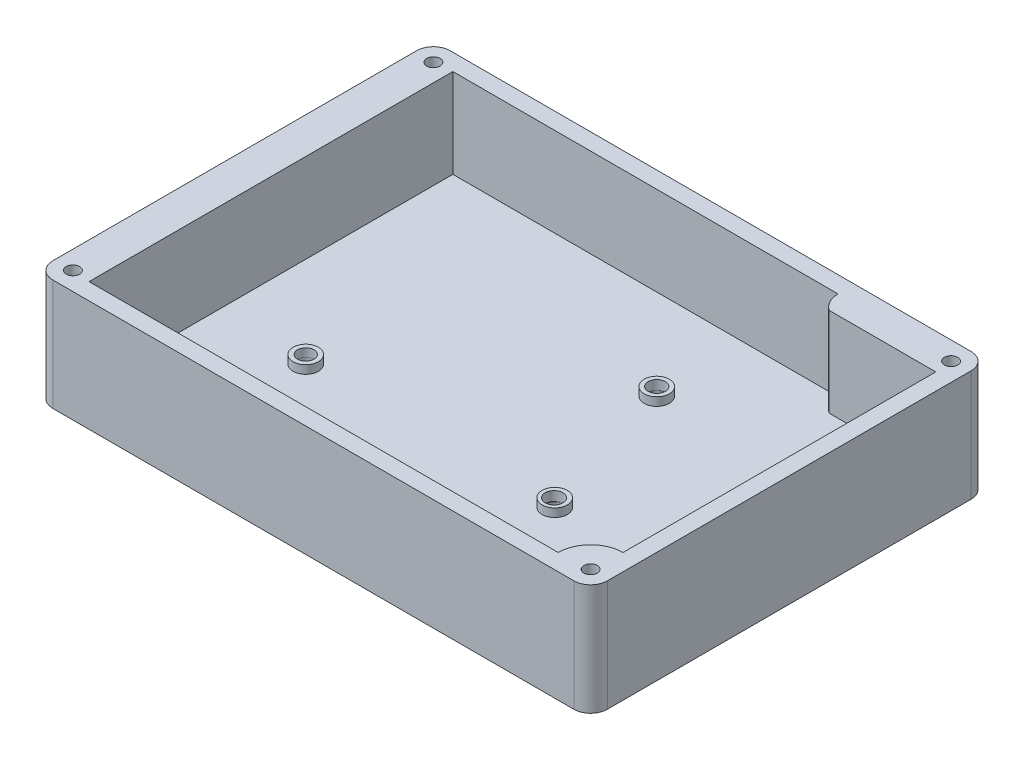
ISO-10303-21;
HEADER;
FILE_DESCRIPTION(('STEP AP214'),'2;1');
FILE_NAME('part.step','',(''),(''),'','','');
FILE_SCHEMA(('AUTOMOTIVE_DESIGN { 1 0 10303 214 1 1 1 1 }'));
ENDSEC;
DATA;
#1=APPLICATION_CONTEXT('core data for automotive mechanical design processes');
#2=APPLICATION_PROTOCOL_DEFINITION('international standard','automotive_design',2000,#1);
#3=PRODUCT_CONTEXT('',#1,'mechanical');
#4=PRODUCT('Part','Part','',(#3));
#5=PRODUCT_RELATED_PRODUCT_CATEGORY('part','',(#4));
#6=PRODUCT_DEFINITION_FORMATION('','',#4);
#7=PRODUCT_DEFINITION_CONTEXT('part definition',#1,'design');
#8=PRODUCT_DEFINITION('design','',#6,#7);
#9=PRODUCT_DEFINITION_SHAPE('','',#8);
#10=(LENGTH_UNIT() NAMED_UNIT(*) SI_UNIT(.MILLI.,.METRE.));
#11=(NAMED_UNIT(*) PLANE_ANGLE_UNIT() SI_UNIT($,.RADIAN.));
#12=(NAMED_UNIT(*) SI_UNIT($,.STERADIAN.) SOLID_ANGLE_UNIT());
#13=UNCERTAINTY_MEASURE_WITH_UNIT(LENGTH_MEASURE(1.E-05),#10,'distance_accuracy_value','');
#14=(GEOMETRIC_REPRESENTATION_CONTEXT(3) GLOBAL_UNCERTAINTY_ASSIGNED_CONTEXT((#13)) GLOBAL_UNIT_ASSIGNED_CONTEXT((#10,
#11,#12)) REPRESENTATION_CONTEXT('',''));
#15=CARTESIAN_POINT('',(0.,0.,0.));
#16=DIRECTION('',(0.,0.,1.));
#17=DIRECTION('',(1.,0.,0.));
#18=AXIS2_PLACEMENT_3D('',#15,#16,#17);
#19=CARTESIAN_POINT('',(48.075,20.,-35.695));
#20=DIRECTION('',(-1.,0.,0.));
#21=DIRECTION('',(0.,0.,1.));
#22=AXIS2_PLACEMENT_3D('',#19,#20,#21);
#23=PLANE('',#22);
#24=DIRECTION('',(0.,0.,-1.));
#25=VECTOR('',#24,1.);
#26=CARTESIAN_POINT('',(48.075,20.,-35.695));
#27=LINE('',#26,#25);
#28=CARTESIAN_POINT('',(48.075,20.,32.695));
#29=VERTEX_POINT('',#28);
#30=CARTESIAN_POINT('',(48.075,20.,-32.695));
#31=VERTEX_POINT('',#30);
#32=EDGE_CURVE('E520',#29,#31,#27,.T.);
#33=ORIENTED_EDGE('',*,*,#32,.F.);
#34=DIRECTION('',(0.,-1.,0.));
#35=VECTOR('',#34,1.);
#36=CARTESIAN_POINT('',(48.075,20.,32.695));
#37=LINE('',#36,#35);
#38=CARTESIAN_POINT('',(48.075,0.,32.695));
#39=VERTEX_POINT('',#38);
#40=EDGE_CURVE('E385',#29,#39,#37,.T.);
#41=ORIENTED_EDGE('',*,*,#40,.T.);
#42=DIRECTION('',(0.,0.,-1.));
#43=VECTOR('',#42,1.);
#44=CARTESIAN_POINT('',(48.075,0.,-35.695));
#45=LINE('',#44,#43);
#46=CARTESIAN_POINT('',(48.075,0.,-32.695));
#47=VERTEX_POINT('',#46);
#48=EDGE_CURVE('E507',#39,#47,#45,.T.);
#49=ORIENTED_EDGE('',*,*,#48,.T.);
#50=DIRECTION('',(0.,-1.,0.));
#51=VECTOR('',#50,1.);
#52=CARTESIAN_POINT('',(48.075,20.,-32.695));
#53=LINE('',#52,#51);
#54=EDGE_CURVE('E403',#47,#31,#53,.F.);
#55=ORIENTED_EDGE('',*,*,#54,.T.);
#56=EDGE_LOOP('',(#33,#41,#49,#55));
#57=FACE_BOUND('',#56,.T.);
#58=ADVANCED_FACE('F43',(#57),#23,.F.);
#59=CARTESIAN_POINT('',(-48.075,20.,-35.695));
#60=DIRECTION('',(0.,0.,1.));
#61=DIRECTION('',(1.,0.,0.));
#62=AXIS2_PLACEMENT_3D('',#59,#60,#61);
#63=PLANE('',#62);
#64=DIRECTION('',(-1.,0.,0.));
#65=VECTOR('',#64,1.);
#66=CARTESIAN_POINT('',(-48.075,0.,-35.695));
#67=LINE('',#66,#65);
#68=CARTESIAN_POINT('',(45.075,0.,-35.695));
#69=VERTEX_POINT('',#68);
#70=CARTESIAN_POINT('',(-48.575,0.,-35.695));
#71=VERTEX_POINT('',#70);
#72=EDGE_CURVE('E534',#69,#71,#67,.T.);
#73=ORIENTED_EDGE('',*,*,#72,.T.);
#74=DIRECTION('',(0.,-1.,0.));
#75=VECTOR('',#74,1.);
#76=CARTESIAN_POINT('',(-48.575,20.,-35.695));
#77=LINE('',#76,#75);
#78=CARTESIAN_POINT('',(-48.575,20.,-35.695));
#79=VERTEX_POINT('',#78);
#80=EDGE_CURVE('E394',#71,#79,#77,.F.);
#81=ORIENTED_EDGE('',*,*,#80,.T.);
#82=DIRECTION('',(-1.,0.,0.));
#83=VECTOR('',#82,1.);
#84=CARTESIAN_POINT('',(-48.075,20.,-35.695));
#85=LINE('',#84,#83);
#86=CARTESIAN_POINT('',(45.075,20.,-35.695));
#87=VERTEX_POINT('',#86);
#88=EDGE_CURVE('E522',#87,#79,#85,.T.);
#89=ORIENTED_EDGE('',*,*,#88,.F.);
#90=DIRECTION('',(0.,-1.,0.));
#91=VECTOR('',#90,1.);
#92=CARTESIAN_POINT('',(45.075,20.,-35.695));
#93=LINE('',#92,#91);
#94=EDGE_CURVE('E553',#87,#69,#93,.T.);
#95=ORIENTED_EDGE('',*,*,#94,.T.);
#96=EDGE_LOOP('',(#73,#81,#89,#95));
#97=FACE_BOUND('',#96,.T.);
#98=ADVANCED_FACE('F360',(#97),#63,.F.);
#99=CARTESIAN_POINT('',(-51.575,20.,-35.695));
#100=DIRECTION('',(1.,0.,0.));
#101=DIRECTION('',(0.,0.,-1.));
#102=AXIS2_PLACEMENT_3D('',#99,#100,#101);
#103=PLANE('',#102);
#104=DIRECTION('',(0.,0.,1.));
#105=VECTOR('',#104,1.);
#106=CARTESIAN_POINT('',(-51.575,20.,-35.695));
#107=LINE('',#106,#105);
#108=CARTESIAN_POINT('',(-51.575,20.,-32.695));
#109=VERTEX_POINT('',#108);
#110=CARTESIAN_POINT('',(-51.575,20.,32.695));
#111=VERTEX_POINT('',#110);
#112=EDGE_CURVE('E526',#109,#111,#107,.T.);
#113=ORIENTED_EDGE('',*,*,#112,.F.);
#114=DIRECTION('',(0.,-1.,0.));
#115=VECTOR('',#114,1.);
#116=CARTESIAN_POINT('',(-51.575,20.,-32.695));
#117=LINE('',#116,#115);
#118=CARTESIAN_POINT('',(-51.575,0.,-32.695));
#119=VERTEX_POINT('',#118);
#120=EDGE_CURVE('E542',#109,#119,#117,.T.);
#121=ORIENTED_EDGE('',*,*,#120,.T.);
#122=DIRECTION('',(0.,0.,1.));
#123=VECTOR('',#122,1.);
#124=CARTESIAN_POINT('',(-51.575,0.,-35.695));
#125=LINE('',#124,#123);
#126=CARTESIAN_POINT('',(-51.575,0.,32.695));
#127=VERTEX_POINT('',#126);
#128=EDGE_CURVE('E537',#119,#127,#125,.T.);
#129=ORIENTED_EDGE('',*,*,#128,.T.);
#130=DIRECTION('',(0.,-1.,0.));
#131=VECTOR('',#130,1.);
#132=CARTESIAN_POINT('',(-51.575,20.,32.695));
#133=LINE('',#132,#131);
#134=EDGE_CURVE('E531',#127,#111,#133,.F.);
#135=ORIENTED_EDGE('',*,*,#134,.T.);
#136=EDGE_LOOP('',(#113,#121,#129,#135));
#137=FACE_BOUND('',#136,.T.);
#138=ADVANCED_FACE('F357',(#137),#103,.F.);
#139=CARTESIAN_POINT('',(-48.075,20.,35.695));
#140=DIRECTION('',(0.,0.,-1.));
#141=DIRECTION('',(-1.,0.,0.));
#142=AXIS2_PLACEMENT_3D('',#139,#140,#141);
#143=PLANE('',#142);
#144=DIRECTION('',(1.,0.,0.));
#145=VECTOR('',#144,1.);
#146=CARTESIAN_POINT('',(-51.575,20.,35.695));
#147=LINE('',#146,#145);
#148=CARTESIAN_POINT('',(-48.575,20.,35.695));
#149=VERTEX_POINT('',#148);
#150=CARTESIAN_POINT('',(45.075,20.,35.695));
#151=VERTEX_POINT('',#150);
#152=EDGE_CURVE('E529',#149,#151,#147,.T.);
#153=ORIENTED_EDGE('',*,*,#152,.F.);
#154=DIRECTION('',(0.,-1.,0.));
#155=VECTOR('',#154,1.);
#156=CARTESIAN_POINT('',(-48.575,20.,35.695));
#157=LINE('',#156,#155);
#158=CARTESIAN_POINT('',(-48.575,0.,35.695));
#159=VERTEX_POINT('',#158);
#160=EDGE_CURVE('E400',#149,#159,#157,.T.);
#161=ORIENTED_EDGE('',*,*,#160,.T.);
#162=DIRECTION('',(1.,0.,0.));
#163=VECTOR('',#162,1.);
#164=CARTESIAN_POINT('',(-48.075,0.,35.695));
#165=LINE('',#164,#163);
#166=CARTESIAN_POINT('',(45.075,0.,35.695));
#167=VERTEX_POINT('',#166);
#168=EDGE_CURVE('E523',#159,#167,#165,.T.);
#169=ORIENTED_EDGE('',*,*,#168,.T.);
#170=DIRECTION('',(0.,-1.,0.));
#171=VECTOR('',#170,1.);
#172=CARTESIAN_POINT('',(45.075,20.,35.695));
#173=LINE('',#172,#171);
#174=EDGE_CURVE('E70',#167,#151,#173,.F.);
#175=ORIENTED_EDGE('',*,*,#174,.T.);
#176=EDGE_LOOP('',(#153,#161,#169,#175));
#177=FACE_BOUND('',#176,.T.);
#178=ADVANCED_FACE('F350',(#177),#143,.F.);
#179=CARTESIAN_POINT('',(0.,20.,0.));
#180=DIRECTION('',(0.,1.,0.));
#181=DIRECTION('',(0.,0.,1.));
#182=AXIS2_PLACEMENT_3D('',#179,#180,#181);
#183=PLANE('',#182);
#184=CARTESIAN_POINT('',(44.775,20.,32.395));
#185=DIRECTION('',(0.,1.,0.));
#186=DIRECTION('',(0.,0.,-1.));
#187=AXIS2_PLACEMENT_3D('',#184,#185,#186);
#188=CIRCLE('',#187,1.2);
#189=CARTESIAN_POINT('',(44.775,20.,31.195));
#190=VERTEX_POINT('',#189);
#191=EDGE_CURVE('E450',#190,#190,#188,.T.);
#192=ORIENTED_EDGE('',*,*,#191,.F.);
#193=EDGE_LOOP('',(#192));
#194=FACE_BOUND('',#193,.T.);
#195=CARTESIAN_POINT('',(-48.275,20.,-32.395));
#196=DIRECTION('',(0.,1.,0.));
#197=DIRECTION('',(0.,0.,-1.));
#198=AXIS2_PLACEMENT_3D('',#195,#196,#197);
#199=CIRCLE('',#198,1.2);
#200=CARTESIAN_POINT('',(-48.275,20.,-33.595));
#201=VERTEX_POINT('',#200);
#202=EDGE_CURVE('E443',#201,#201,#199,.T.);
#203=ORIENTED_EDGE('',*,*,#202,.F.);
#204=EDGE_LOOP('',(#203));
#205=FACE_BOUND('',#204,.T.);
#206=CARTESIAN_POINT('',(44.775,20.,-32.395));
#207=DIRECTION('',(0.,1.,0.));
#208=DIRECTION('',(0.,0.,1.));
#209=AXIS2_PLACEMENT_3D('',#206,#207,#208);
#210=CIRCLE('',#209,1.2);
#211=CARTESIAN_POINT('',(44.775,20.,-31.195));
#212=VERTEX_POINT('',#211);
#213=EDGE_CURVE('E439',#212,#212,#210,.T.);
#214=ORIENTED_EDGE('',*,*,#213,.F.);
#215=EDGE_LOOP('',(#214));
#216=FACE_BOUND('',#215,.T.);
#217=CARTESIAN_POINT('',(-48.275,20.,32.395));
#218=DIRECTION('',(0.,1.,0.));
#219=DIRECTION('',(0.,0.,1.));
#220=AXIS2_PLACEMENT_3D('',#217,#218,#219);
#221=CIRCLE('',#220,1.2);
#222=CARTESIAN_POINT('',(-48.275,20.,33.595));
#223=VERTEX_POINT('',#222);
#224=EDGE_CURVE('E449',#223,#223,#221,.T.);
#225=ORIENTED_EDGE('',*,*,#224,.F.);
#226=EDGE_LOOP('',(#225));
#227=FACE_BOUND('',#226,.T.);
#228=DIRECTION('',(0.,0.,1.));
#229=VECTOR('',#228,1.);
#230=CARTESIAN_POINT('',(-45.075,20.,-32.695));
#231=LINE('',#230,#229);
#232=CARTESIAN_POINT('',(-45.075,20.,-32.695));
#233=VERTEX_POINT('',#232);
#234=CARTESIAN_POINT('',(-45.075,20.,32.695));
#235=VERTEX_POINT('',#234);
#236=EDGE_CURVE('E461',#233,#235,#231,.T.);
#237=ORIENTED_EDGE('',*,*,#236,.F.);
#238=DIRECTION('',(-1.,0.,0.));
#239=VECTOR('',#238,1.);
#240=CARTESIAN_POINT('',(-45.075,20.,-32.695));
#241=LINE('',#240,#239);
#242=CARTESIAN_POINT('',(24.1500945233502,20.,-32.695));
#243=VERTEX_POINT('',#242);
#244=EDGE_CURVE('E468',#243,#233,#241,.T.);
#245=ORIENTED_EDGE('',*,*,#244,.F.);
#246=CARTESIAN_POINT('',(28.2278468412559,20.,-32.695));
#247=DIRECTION('',(0.,-1.,0.));
#248=DIRECTION('',(0.,0.,-1.));
#249=AXIS2_PLACEMENT_3D('',#246,#247,#248);
#250=CIRCLE('',#249,4.07775231790571);
#251=CARTESIAN_POINT('',(25.9073219472979,20.,-29.3419076686279));
#252=VERTEX_POINT('',#251);
#253=EDGE_CURVE('E500',#252,#243,#250,.T.);
#254=ORIENTED_EDGE('',*,*,#253,.F.);
#255=DIRECTION('',(-1.,0.,0.));
#256=VECTOR('',#255,1.);
#257=CARTESIAN_POINT('',(45.075,20.,-29.3419076686279));
#258=LINE('',#257,#256);
#259=CARTESIAN_POINT('',(45.075,20.,-29.3419076686279));
#260=VERTEX_POINT('',#259);
#261=EDGE_CURVE('E497',#260,#252,#258,.T.);
#262=ORIENTED_EDGE('',*,*,#261,.F.);
#263=DIRECTION('',(0.,0.,-1.));
#264=VECTOR('',#263,1.);
#265=CARTESIAN_POINT('',(45.075,20.,-29.3419076686279));
#266=LINE('',#265,#264);
#267=CARTESIAN_POINT('',(45.075,20.,26.8743007012948));
#268=VERTEX_POINT('',#267);
#269=EDGE_CURVE('E494',#268,#260,#266,.T.);
#270=ORIENTED_EDGE('',*,*,#269,.F.);
#271=CARTESIAN_POINT('',(45.075,20.,32.695));
#272=DIRECTION('',(0.,-1.,0.));
#273=DIRECTION('',(0.,0.,1.));
#274=AXIS2_PLACEMENT_3D('',#271,#272,#273);
#275=CIRCLE('',#274,5.8206992987052);
#276=CARTESIAN_POINT('',(39.2543007012948,20.,32.695));
#277=VERTEX_POINT('',#276);
#278=EDGE_CURVE('E491',#277,#268,#275,.T.);
#279=ORIENTED_EDGE('',*,*,#278,.F.);
#280=DIRECTION('',(1.,0.,0.));
#281=VECTOR('',#280,1.);
#282=CARTESIAN_POINT('',(-45.075,20.,32.695));
#283=LINE('',#282,#281);
#284=EDGE_CURVE('E488',#235,#277,#283,.T.);
#285=ORIENTED_EDGE('',*,*,#284,.F.);
#286=EDGE_LOOP('',(#237,#245,#254,#262,#270,#279,#285));
#287=FACE_BOUND('',#286,.T.);
#288=ORIENTED_EDGE('',*,*,#88,.T.);
#289=CARTESIAN_POINT('',(-48.575,20.,-32.695));
#290=DIRECTION('',(0.,1.,0.));
#291=DIRECTION('',(0.,0.,1.));
#292=AXIS2_PLACEMENT_3D('',#289,#290,#291);
#293=CIRCLE('',#292,3.);
#294=EDGE_CURVE('E392',#79,#109,#293,.T.);
#295=ORIENTED_EDGE('',*,*,#294,.T.);
#296=ORIENTED_EDGE('',*,*,#112,.T.);
#297=CARTESIAN_POINT('',(-48.575,20.,32.695));
#298=DIRECTION('',(0.,1.,0.));
#299=DIRECTION('',(0.,0.,1.));
#300=AXIS2_PLACEMENT_3D('',#297,#298,#299);
#301=CIRCLE('',#300,3.);
#302=EDGE_CURVE('E389',#111,#149,#301,.T.);
#303=ORIENTED_EDGE('',*,*,#302,.T.);
#304=ORIENTED_EDGE('',*,*,#152,.T.);
#305=CARTESIAN_POINT('',(45.075,20.,32.695));
#306=DIRECTION('',(0.,1.,0.));
#307=DIRECTION('',(0.,0.,1.));
#308=AXIS2_PLACEMENT_3D('',#305,#306,#307);
#309=CIRCLE('',#308,3.);
#310=EDGE_CURVE('E383',#151,#29,#309,.T.);
#311=ORIENTED_EDGE('',*,*,#310,.T.);
#312=ORIENTED_EDGE('',*,*,#32,.T.);
#313=CARTESIAN_POINT('',(45.075,20.,-32.695));
#314=DIRECTION('',(0.,1.,0.));
#315=DIRECTION('',(0.,0.,1.));
#316=AXIS2_PLACEMENT_3D('',#313,#314,#315);
#317=CIRCLE('',#316,3.);
#318=EDGE_CURVE('E390',#31,#87,#317,.T.);
#319=ORIENTED_EDGE('',*,*,#318,.T.);
#320=EDGE_LOOP('',(#288,#295,#296,#303,#304,#311,#312,#319));
#321=FACE_BOUND('',#320,.T.);
#322=ADVANCED_FACE('F347',(#194,#205,#216,#227,#287,#321),#183,.T.);
#323=CARTESIAN_POINT('',(0.,0.,0.));
#324=DIRECTION('',(0.,1.,0.));
#325=DIRECTION('',(0.,0.,1.));
#326=AXIS2_PLACEMENT_3D('',#323,#324,#325);
#327=PLANE('',#326);
#328=ORIENTED_EDGE('',*,*,#128,.F.);
#329=CARTESIAN_POINT('',(-48.575,0.,-32.695));
#330=DIRECTION('',(0.,1.,0.));
#331=DIRECTION('',(0.,0.,1.));
#332=AXIS2_PLACEMENT_3D('',#329,#330,#331);
#333=CIRCLE('',#332,3.);
#334=EDGE_CURVE('E551',#119,#71,#333,.F.);
#335=ORIENTED_EDGE('',*,*,#334,.T.);
#336=ORIENTED_EDGE('',*,*,#72,.F.);
#337=CARTESIAN_POINT('',(45.075,0.,-32.695));
#338=DIRECTION('',(0.,1.,0.));
#339=DIRECTION('',(0.,0.,1.));
#340=AXIS2_PLACEMENT_3D('',#337,#338,#339);
#341=CIRCLE('',#340,3.);
#342=EDGE_CURVE('E545',#69,#47,#341,.F.);
#343=ORIENTED_EDGE('',*,*,#342,.T.);
#344=ORIENTED_EDGE('',*,*,#48,.F.);
#345=CARTESIAN_POINT('',(45.075,0.,32.695));
#346=DIRECTION('',(0.,1.,0.));
#347=DIRECTION('',(0.,0.,1.));
#348=AXIS2_PLACEMENT_3D('',#345,#346,#347);
#349=CIRCLE('',#348,3.);
#350=EDGE_CURVE('E547',#39,#167,#349,.F.);
#351=ORIENTED_EDGE('',*,*,#350,.T.);
#352=ORIENTED_EDGE('',*,*,#168,.F.);
#353=CARTESIAN_POINT('',(-48.575,0.,32.695));
#354=DIRECTION('',(0.,1.,0.));
#355=DIRECTION('',(0.,0.,1.));
#356=AXIS2_PLACEMENT_3D('',#353,#354,#355);
#357=CIRCLE('',#356,3.);
#358=EDGE_CURVE('E549',#159,#127,#357,.F.);
#359=ORIENTED_EDGE('',*,*,#358,.T.);
#360=EDGE_LOOP('',(#328,#335,#336,#343,#344,#351,#352,#359));
#361=FACE_BOUND('',#360,.T.);
#362=ADVANCED_FACE('F345',(#361),#327,.F.);
#363=CARTESIAN_POINT('',(-45.075,4.,-32.695));
#364=DIRECTION('',(-1.,0.,0.));
#365=DIRECTION('',(0.,0.,1.));
#366=AXIS2_PLACEMENT_3D('',#363,#364,#365);
#367=PLANE('',#366);
#368=ORIENTED_EDGE('',*,*,#236,.T.);
#369=DIRECTION('',(0.,1.,0.));
#370=VECTOR('',#369,1.);
#371=CARTESIAN_POINT('',(-45.075,4.,32.695));
#372=LINE('',#371,#370);
#373=CARTESIAN_POINT('',(-45.075,4.,32.695));
#374=VERTEX_POINT('',#373);
#375=EDGE_CURVE('E486',#374,#235,#372,.T.);
#376=ORIENTED_EDGE('',*,*,#375,.F.);
#377=DIRECTION('',(0.,0.,1.));
#378=VECTOR('',#377,1.);
#379=CARTESIAN_POINT('',(-45.075,4.,-32.695));
#380=LINE('',#379,#378);
#381=CARTESIAN_POINT('',(-45.075,4.,-32.695));
#382=VERTEX_POINT('',#381);
#383=EDGE_CURVE('E464',#382,#374,#380,.T.);
#384=ORIENTED_EDGE('',*,*,#383,.F.);
#385=DIRECTION('',(0.,1.,0.));
#386=VECTOR('',#385,1.);
#387=CARTESIAN_POINT('',(-45.075,4.,-32.695));
#388=LINE('',#387,#386);
#389=EDGE_CURVE('E505',#382,#233,#388,.T.);
#390=ORIENTED_EDGE('',*,*,#389,.T.);
#391=EDGE_LOOP('',(#368,#376,#384,#390));
#392=FACE_BOUND('',#391,.T.);
#393=ADVANCED_FACE('F323',(#392),#367,.F.);
#394=CARTESIAN_POINT('',(-45.075,4.,-32.695));
#395=DIRECTION('',(0.,0.,-1.));
#396=DIRECTION('',(-1.,0.,0.));
#397=AXIS2_PLACEMENT_3D('',#394,#395,#396);
#398=PLANE('',#397);
#399=ORIENTED_EDGE('',*,*,#244,.T.);
#400=ORIENTED_EDGE('',*,*,#389,.F.);
#401=DIRECTION('',(-1.,0.,0.));
#402=VECTOR('',#401,1.);
#403=CARTESIAN_POINT('',(-45.075,4.,-32.695));
#404=LINE('',#403,#402);
#405=CARTESIAN_POINT('',(24.1500945233502,4.,-32.695));
#406=VERTEX_POINT('',#405);
#407=EDGE_CURVE('E483',#406,#382,#404,.T.);
#408=ORIENTED_EDGE('',*,*,#407,.F.);
#409=DIRECTION('',(0.,1.,0.));
#410=VECTOR('',#409,1.);
#411=CARTESIAN_POINT('',(24.1500945233502,4.,-32.695));
#412=LINE('',#411,#410);
#413=EDGE_CURVE('E508',#406,#243,#412,.T.);
#414=ORIENTED_EDGE('',*,*,#413,.T.);
#415=EDGE_LOOP('',(#399,#400,#408,#414));
#416=FACE_BOUND('',#415,.T.);
#417=ADVANCED_FACE('F319',(#416),#398,.F.);
#418=CARTESIAN_POINT('',(28.2278468412559,4.,-32.695));
#419=DIRECTION('',(0.,1.,0.));
#420=DIRECTION('',(0.,0.,1.));
#421=AXIS2_PLACEMENT_3D('',#418,#419,#420);
#422=CYLINDRICAL_SURFACE('',#421,4.07775231790571);
#423=ORIENTED_EDGE('',*,*,#253,.T.);
#424=ORIENTED_EDGE('',*,*,#413,.F.);
#425=CARTESIAN_POINT('',(28.2278468412559,4.,-32.695));
#426=DIRECTION('',(0.,-1.,0.));
#427=DIRECTION('',(0.,0.,-1.));
#428=AXIS2_PLACEMENT_3D('',#425,#426,#427);
#429=CIRCLE('',#428,4.07775231790571);
#430=CARTESIAN_POINT('',(25.9073219472979,4.,-29.3419076686279));
#431=VERTEX_POINT('',#430);
#432=EDGE_CURVE('E480',#431,#406,#429,.T.);
#433=ORIENTED_EDGE('',*,*,#432,.F.);
#434=DIRECTION('',(0.,1.,0.));
#435=VECTOR('',#434,1.);
#436=CARTESIAN_POINT('',(25.9073219472979,4.,-29.3419076686279));
#437=LINE('',#436,#435);
#438=EDGE_CURVE('E510',#431,#252,#437,.T.);
#439=ORIENTED_EDGE('',*,*,#438,.T.);
#440=EDGE_LOOP('',(#423,#424,#433,#439));
#441=FACE_BOUND('',#440,.T.);
#442=ADVANCED_FACE('F322',(#441),#422,.T.);
#443=CARTESIAN_POINT('',(45.075,4.,-29.3419076686279));
#444=DIRECTION('',(0.,0.,-1.));
#445=DIRECTION('',(-1.,0.,0.));
#446=AXIS2_PLACEMENT_3D('',#443,#444,#445);
#447=PLANE('',#446);
#448=ORIENTED_EDGE('',*,*,#261,.T.);
#449=ORIENTED_EDGE('',*,*,#438,.F.);
#450=DIRECTION('',(-1.,0.,0.));
#451=VECTOR('',#450,1.);
#452=CARTESIAN_POINT('',(45.075,4.,-29.3419076686279));
#453=LINE('',#452,#451);
#454=CARTESIAN_POINT('',(45.075,4.,-29.3419076686279));
#455=VERTEX_POINT('',#454);
#456=EDGE_CURVE('E477',#455,#431,#453,.T.);
#457=ORIENTED_EDGE('',*,*,#456,.F.);
#458=DIRECTION('',(0.,1.,0.));
#459=VECTOR('',#458,1.);
#460=CARTESIAN_POINT('',(45.075,4.,-29.3419076686279));
#461=LINE('',#460,#459);
#462=EDGE_CURVE('E512',#455,#260,#461,.T.);
#463=ORIENTED_EDGE('',*,*,#462,.T.);
#464=EDGE_LOOP('',(#448,#449,#457,#463));
#465=FACE_BOUND('',#464,.T.);
#466=ADVANCED_FACE('F327',(#465),#447,.F.);
#467=CARTESIAN_POINT('',(45.075,4.,-29.3419076686279));
#468=DIRECTION('',(1.,0.,0.));
#469=DIRECTION('',(0.,0.,-1.));
#470=AXIS2_PLACEMENT_3D('',#467,#468,#469);
#471=PLANE('',#470);
#472=ORIENTED_EDGE('',*,*,#269,.T.);
#473=ORIENTED_EDGE('',*,*,#462,.F.);
#474=DIRECTION('',(0.,0.,-1.));
#475=VECTOR('',#474,1.);
#476=CARTESIAN_POINT('',(45.075,4.,-29.3419076686279));
#477=LINE('',#476,#475);
#478=CARTESIAN_POINT('',(45.075,4.,26.8743007012948));
#479=VERTEX_POINT('',#478);
#480=EDGE_CURVE('E474',#479,#455,#477,.T.);
#481=ORIENTED_EDGE('',*,*,#480,.F.);
#482=DIRECTION('',(0.,1.,0.));
#483=VECTOR('',#482,1.);
#484=CARTESIAN_POINT('',(45.075,4.,26.8743007012948));
#485=LINE('',#484,#483);
#486=EDGE_CURVE('E514',#479,#268,#485,.T.);
#487=ORIENTED_EDGE('',*,*,#486,.T.);
#488=EDGE_LOOP('',(#472,#473,#481,#487));
#489=FACE_BOUND('',#488,.T.);
#490=ADVANCED_FACE('F331',(#489),#471,.F.);
#491=CARTESIAN_POINT('',(45.075,4.,32.695));
#492=DIRECTION('',(0.,1.,0.));
#493=DIRECTION('',(0.,0.,1.));
#494=AXIS2_PLACEMENT_3D('',#491,#492,#493);
#495=CYLINDRICAL_SURFACE('',#494,5.8206992987052);
#496=ORIENTED_EDGE('',*,*,#278,.T.);
#497=ORIENTED_EDGE('',*,*,#486,.F.);
#498=CARTESIAN_POINT('',(45.075,4.,32.695));
#499=DIRECTION('',(0.,-1.,0.));
#500=DIRECTION('',(0.,0.,1.));
#501=AXIS2_PLACEMENT_3D('',#498,#499,#500);
#502=CIRCLE('',#501,5.8206992987052);
#503=CARTESIAN_POINT('',(39.2543007012948,4.,32.695));
#504=VERTEX_POINT('',#503);
#505=EDGE_CURVE('E471',#504,#479,#502,.T.);
#506=ORIENTED_EDGE('',*,*,#505,.F.);
#507=DIRECTION('',(0.,1.,0.));
#508=VECTOR('',#507,1.);
#509=CARTESIAN_POINT('',(39.2543007012948,4.,32.695));
#510=LINE('',#509,#508);
#511=EDGE_CURVE('E516',#504,#277,#510,.T.);
#512=ORIENTED_EDGE('',*,*,#511,.T.);
#513=EDGE_LOOP('',(#496,#497,#506,#512));
#514=FACE_BOUND('',#513,.T.);
#515=ADVANCED_FACE('F335',(#514),#495,.T.);
#516=CARTESIAN_POINT('',(-45.075,4.,32.695));
#517=DIRECTION('',(0.,0.,1.));
#518=DIRECTION('',(1.,0.,0.));
#519=AXIS2_PLACEMENT_3D('',#516,#517,#518);
#520=PLANE('',#519);
#521=ORIENTED_EDGE('',*,*,#284,.T.);
#522=ORIENTED_EDGE('',*,*,#511,.F.);
#523=DIRECTION('',(1.,0.,0.));
#524=VECTOR('',#523,1.);
#525=CARTESIAN_POINT('',(-45.075,4.,32.695));
#526=LINE('',#525,#524);
#527=EDGE_CURVE('E467',#374,#504,#526,.T.);
#528=ORIENTED_EDGE('',*,*,#527,.F.);
#529=ORIENTED_EDGE('',*,*,#375,.T.);
#530=EDGE_LOOP('',(#521,#522,#528,#529));
#531=FACE_BOUND('',#530,.T.);
#532=ADVANCED_FACE('F317',(#531),#520,.F.);
#533=CARTESIAN_POINT('',(45.075,4.,32.695));
#534=DIRECTION('',(0.,1.,0.));
#535=DIRECTION('',(0.,0.,1.));
#536=AXIS2_PLACEMENT_3D('',#533,#534,#535);
#537=PLANE('',#536);
#538=CARTESIAN_POINT('',(7.76682925542833,4.,-16.4978649248778));
#539=DIRECTION('',(0.,1.,0.));
#540=DIRECTION('',(0.,0.,1.));
#541=AXIS2_PLACEMENT_3D('',#538,#539,#540);
#542=CIRCLE('',#541,2.263248582784);
#543=CARTESIAN_POINT('',(7.76682925542833,4.,-14.2346163420938));
#544=VERTEX_POINT('',#543);
#545=EDGE_CURVE('E199',#544,#544,#542,.T.);
#546=ORIENTED_EDGE('',*,*,#545,.F.);
#547=EDGE_LOOP('',(#546));
#548=FACE_BOUND('',#547,.T.);
#549=CARTESIAN_POINT('',(15.9021683756606,4.,9.97270352169754));
#550=DIRECTION('',(0.,1.,0.));
#551=DIRECTION('',(0.,0.,1.));
#552=AXIS2_PLACEMENT_3D('',#549,#550,#551);
#553=CIRCLE('',#552,2.263248582784);
#554=CARTESIAN_POINT('',(15.9021683756606,4.,12.2359521044815));
#555=VERTEX_POINT('',#554);
#556=EDGE_CURVE('E416',#555,#555,#553,.T.);
#557=ORIENTED_EDGE('',*,*,#556,.F.);
#558=EDGE_LOOP('',(#557));
#559=FACE_BOUND('',#558,.T.);
#560=CARTESIAN_POINT('',(-28.7628252691963,4.,10.0572935015966));
#561=DIRECTION('',(0.,1.,0.));
#562=DIRECTION('',(0.,0.,1.));
#563=AXIS2_PLACEMENT_3D('',#560,#561,#562);
#564=CIRCLE('',#563,2.263248582784);
#565=CARTESIAN_POINT('',(-28.7628252691963,4.,12.3205420843806));
#566=VERTEX_POINT('',#565);
#567=EDGE_CURVE('E419',#566,#566,#564,.T.);
#568=ORIENTED_EDGE('',*,*,#567,.F.);
#569=EDGE_LOOP('',(#568));
#570=FACE_BOUND('',#569,.T.);
#571=ORIENTED_EDGE('',*,*,#383,.T.);
#572=ORIENTED_EDGE('',*,*,#527,.T.);
#573=ORIENTED_EDGE('',*,*,#505,.T.);
#574=ORIENTED_EDGE('',*,*,#480,.T.);
#575=ORIENTED_EDGE('',*,*,#456,.T.);
#576=ORIENTED_EDGE('',*,*,#432,.T.);
#577=ORIENTED_EDGE('',*,*,#407,.T.);
#578=EDGE_LOOP('',(#571,#572,#573,#574,#575,#576,#577));
#579=FACE_BOUND('',#578,.T.);
#580=ADVANCED_FACE('F313',(#548,#559,#570,#579),#537,.T.);
#581=CARTESIAN_POINT('',(-48.575,20.,-32.695));
#582=DIRECTION('',(0.,-1.,0.));
#583=DIRECTION('',(0.,0.,-1.));
#584=AXIS2_PLACEMENT_3D('',#581,#582,#583);
#585=CYLINDRICAL_SURFACE('',#584,3.);
#586=ORIENTED_EDGE('',*,*,#294,.F.);
#587=ORIENTED_EDGE('',*,*,#80,.F.);
#588=ORIENTED_EDGE('',*,*,#334,.F.);
#589=ORIENTED_EDGE('',*,*,#120,.F.);
#590=EDGE_LOOP('',(#586,#587,#588,#589));
#591=FACE_BOUND('',#590,.T.);
#592=ADVANCED_FACE('F316',(#591),#585,.T.);
#593=CARTESIAN_POINT('',(-48.575,20.,32.695));
#594=DIRECTION('',(0.,-1.,0.));
#595=DIRECTION('',(0.,0.,-1.));
#596=AXIS2_PLACEMENT_3D('',#593,#594,#595);
#597=CYLINDRICAL_SURFACE('',#596,3.);
#598=ORIENTED_EDGE('',*,*,#302,.F.);
#599=ORIENTED_EDGE('',*,*,#134,.F.);
#600=ORIENTED_EDGE('',*,*,#358,.F.);
#601=ORIENTED_EDGE('',*,*,#160,.F.);
#602=EDGE_LOOP('',(#598,#599,#600,#601));
#603=FACE_BOUND('',#602,.T.);
#604=ADVANCED_FACE('F370',(#603),#597,.T.);
#605=CARTESIAN_POINT('',(45.075,20.,32.695));
#606=DIRECTION('',(0.,-1.,0.));
#607=DIRECTION('',(0.,0.,-1.));
#608=AXIS2_PLACEMENT_3D('',#605,#606,#607);
#609=CYLINDRICAL_SURFACE('',#608,3.);
#610=ORIENTED_EDGE('',*,*,#310,.F.);
#611=ORIENTED_EDGE('',*,*,#174,.F.);
#612=ORIENTED_EDGE('',*,*,#350,.F.);
#613=ORIENTED_EDGE('',*,*,#40,.F.);
#614=EDGE_LOOP('',(#610,#611,#612,#613));
#615=FACE_BOUND('',#614,.T.);
#616=ADVANCED_FACE('F373',(#615),#609,.T.);
#617=CARTESIAN_POINT('',(45.075,20.,-32.695));
#618=DIRECTION('',(0.,-1.,0.));
#619=DIRECTION('',(0.,0.,-1.));
#620=AXIS2_PLACEMENT_3D('',#617,#618,#619);
#621=CYLINDRICAL_SURFACE('',#620,3.);
#622=ORIENTED_EDGE('',*,*,#318,.F.);
#623=ORIENTED_EDGE('',*,*,#54,.F.);
#624=ORIENTED_EDGE('',*,*,#342,.F.);
#625=ORIENTED_EDGE('',*,*,#94,.F.);
#626=EDGE_LOOP('',(#622,#623,#624,#625));
#627=FACE_BOUND('',#626,.T.);
#628=ADVANCED_FACE('F45',(#627),#621,.T.);
#629=CARTESIAN_POINT('',(-48.275,10.,32.395));
#630=DIRECTION('',(0.,1.,0.));
#631=DIRECTION('',(0.,0.,1.));
#632=AXIS2_PLACEMENT_3D('',#629,#630,#631);
#633=CYLINDRICAL_SURFACE('',#632,1.2);
#634=CARTESIAN_POINT('',(-48.275,10.,32.395));
#635=DIRECTION('',(0.,1.,0.));
#636=DIRECTION('',(0.,0.,1.));
#637=AXIS2_PLACEMENT_3D('',#634,#635,#636);
#638=CIRCLE('',#637,1.2);
#639=CARTESIAN_POINT('',(-48.275,10.,33.595));
#640=VERTEX_POINT('',#639);
#641=EDGE_CURVE('E458',#640,#640,#638,.T.);
#642=ORIENTED_EDGE('',*,*,#641,.F.);
#643=EDGE_LOOP('',(#642));
#644=FACE_BOUND('',#643,.T.);
#645=ORIENTED_EDGE('',*,*,#224,.T.);
#646=EDGE_LOOP('',(#645));
#647=FACE_BOUND('',#646,.T.);
#648=ADVANCED_FACE('F308',(#644,#647),#633,.F.);
#649=CARTESIAN_POINT('',(-48.275,10.,32.395));
#650=DIRECTION('',(0.,1.,0.));
#651=DIRECTION('',(0.,0.,1.));
#652=AXIS2_PLACEMENT_3D('',#649,#650,#651);
#653=PLANE('',#652);
#654=ORIENTED_EDGE('',*,*,#641,.T.);
#655=EDGE_LOOP('',(#654));
#656=FACE_BOUND('',#655,.T.);
#657=ADVANCED_FACE('F290',(#656),#653,.T.);
#658=CARTESIAN_POINT('',(44.775,10.,-32.395));
#659=DIRECTION('',(0.,1.,0.));
#660=DIRECTION('',(0.,0.,1.));
#661=AXIS2_PLACEMENT_3D('',#658,#659,#660);
#662=CYLINDRICAL_SURFACE('',#661,1.2);
#663=CARTESIAN_POINT('',(44.775,10.,-32.395));
#664=DIRECTION('',(0.,1.,0.));
#665=DIRECTION('',(0.,0.,1.));
#666=AXIS2_PLACEMENT_3D('',#663,#664,#665);
#667=CIRCLE('',#666,1.2);
#668=CARTESIAN_POINT('',(44.775,10.,-31.195));
#669=VERTEX_POINT('',#668);
#670=EDGE_CURVE('E440',#669,#669,#667,.T.);
#671=ORIENTED_EDGE('',*,*,#670,.F.);
#672=EDGE_LOOP('',(#671));
#673=FACE_BOUND('',#672,.T.);
#674=ORIENTED_EDGE('',*,*,#213,.T.);
#675=EDGE_LOOP('',(#674));
#676=FACE_BOUND('',#675,.T.);
#677=ADVANCED_FACE('F286',(#673,#676),#662,.F.);
#678=CARTESIAN_POINT('',(44.775,10.,-32.395));
#679=DIRECTION('',(0.,1.,0.));
#680=DIRECTION('',(0.,0.,1.));
#681=AXIS2_PLACEMENT_3D('',#678,#679,#680);
#682=PLANE('',#681);
#683=ORIENTED_EDGE('',*,*,#670,.T.);
#684=EDGE_LOOP('',(#683));
#685=FACE_BOUND('',#684,.T.);
#686=ADVANCED_FACE('F282',(#685),#682,.T.);
#687=CARTESIAN_POINT('',(-48.275,10.,-32.395));
#688=DIRECTION('',(0.,1.,0.));
#689=DIRECTION('',(0.,0.,1.));
#690=AXIS2_PLACEMENT_3D('',#687,#688,#689);
#691=CYLINDRICAL_SURFACE('',#690,1.2);
#692=CARTESIAN_POINT('',(-48.275,10.,-32.395));
#693=DIRECTION('',(0.,1.,0.));
#694=DIRECTION('',(0.,0.,-1.));
#695=AXIS2_PLACEMENT_3D('',#692,#693,#694);
#696=CIRCLE('',#695,1.2);
#697=CARTESIAN_POINT('',(-48.275,10.,-33.595));
#698=VERTEX_POINT('',#697);
#699=EDGE_CURVE('E453',#698,#698,#696,.T.);
#700=ORIENTED_EDGE('',*,*,#699,.F.);
#701=EDGE_LOOP('',(#700));
#702=FACE_BOUND('',#701,.T.);
#703=ORIENTED_EDGE('',*,*,#202,.T.);
#704=EDGE_LOOP('',(#703));
#705=FACE_BOUND('',#704,.T.);
#706=ADVANCED_FACE('F285',(#702,#705),#691,.F.);
#707=CARTESIAN_POINT('',(-48.275,10.,-32.395));
#708=DIRECTION('',(0.,-1.,0.));
#709=DIRECTION('',(0.,0.,-1.));
#710=AXIS2_PLACEMENT_3D('',#707,#708,#709);
#711=PLANE('',#710);
#712=ORIENTED_EDGE('',*,*,#699,.T.);
#713=EDGE_LOOP('',(#712));
#714=FACE_BOUND('',#713,.T.);
#715=ADVANCED_FACE('F298',(#714),#711,.F.);
#716=CARTESIAN_POINT('',(44.775,10.,32.395));
#717=DIRECTION('',(0.,1.,0.));
#718=DIRECTION('',(0.,0.,1.));
#719=AXIS2_PLACEMENT_3D('',#716,#717,#718);
#720=CYLINDRICAL_SURFACE('',#719,1.2);
#721=CARTESIAN_POINT('',(44.775,10.,32.395));
#722=DIRECTION('',(0.,1.,0.));
#723=DIRECTION('',(0.,0.,-1.));
#724=AXIS2_PLACEMENT_3D('',#721,#722,#723);
#725=CIRCLE('',#724,1.2);
#726=CARTESIAN_POINT('',(44.775,10.,31.195));
#727=VERTEX_POINT('',#726);
#728=EDGE_CURVE('E446',#727,#727,#725,.T.);
#729=ORIENTED_EDGE('',*,*,#728,.F.);
#730=EDGE_LOOP('',(#729));
#731=FACE_BOUND('',#730,.T.);
#732=ORIENTED_EDGE('',*,*,#191,.T.);
#733=EDGE_LOOP('',(#732));
#734=FACE_BOUND('',#733,.T.);
#735=ADVANCED_FACE('F294',(#731,#734),#720,.F.);
#736=CARTESIAN_POINT('',(44.775,10.,32.395));
#737=DIRECTION('',(0.,-1.,0.));
#738=DIRECTION('',(0.,0.,-1.));
#739=AXIS2_PLACEMENT_3D('',#736,#737,#738);
#740=PLANE('',#739);
#741=ORIENTED_EDGE('',*,*,#728,.T.);
#742=EDGE_LOOP('',(#741));
#743=FACE_BOUND('',#742,.T.);
#744=ADVANCED_FACE('F260',(#743),#740,.F.);
#745=CARTESIAN_POINT('',(-28.7628252691963,5.5,10.0572935015966));
#746=DIRECTION('',(0.,-1.,0.));
#747=DIRECTION('',(0.,0.,-1.));
#748=AXIS2_PLACEMENT_3D('',#745,#746,#747);
#749=CYLINDRICAL_SURFACE('',#748,2.263248582784);
#750=CARTESIAN_POINT('',(-28.7628252691963,5.5,10.0572935015966));
#751=DIRECTION('',(0.,1.,0.));
#752=DIRECTION('',(0.,0.,1.));
#753=AXIS2_PLACEMENT_3D('',#750,#751,#752);
#754=CIRCLE('',#753,2.263248582784);
#755=CARTESIAN_POINT('',(-28.7628252691963,5.5,12.3205420843806));
#756=VERTEX_POINT('',#755);
#757=EDGE_CURVE('E422',#756,#756,#754,.T.);
#758=ORIENTED_EDGE('',*,*,#757,.F.);
#759=EDGE_LOOP('',(#758));
#760=FACE_BOUND('',#759,.T.);
#761=ORIENTED_EDGE('',*,*,#567,.T.);
#762=EDGE_LOOP('',(#761));
#763=FACE_BOUND('',#762,.T.);
#764=ADVANCED_FACE('F250',(#760,#763),#749,.T.);
#765=CARTESIAN_POINT('',(-28.7628252691963,5.5,10.0572935015966));
#766=DIRECTION('',(0.,1.,0.));
#767=DIRECTION('',(0.,0.,1.));
#768=AXIS2_PLACEMENT_3D('',#765,#766,#767);
#769=PLANE('',#768);
#770=CARTESIAN_POINT('',(-28.7628252691963,5.5,10.0572935015966));
#771=DIRECTION('',(0.,1.,0.));
#772=DIRECTION('',(0.,0.,1.));
#773=AXIS2_PLACEMENT_3D('',#770,#771,#772);
#774=CIRCLE('',#773,1.47530004295043);
#775=CARTESIAN_POINT('',(-28.7628252691963,5.5,11.532593544547));
#776=VERTEX_POINT('',#775);
#777=EDGE_CURVE('E193',#776,#776,#774,.T.);
#778=ORIENTED_EDGE('',*,*,#777,.F.);
#779=EDGE_LOOP('',(#778));
#780=FACE_BOUND('',#779,.T.);
#781=ORIENTED_EDGE('',*,*,#757,.T.);
#782=EDGE_LOOP('',(#781));
#783=FACE_BOUND('',#782,.T.);
#784=ADVANCED_FACE('F243',(#780,#783),#769,.T.);
#785=CARTESIAN_POINT('',(15.9021683756606,5.5,9.97270352169754));
#786=DIRECTION('',(0.,-1.,0.));
#787=DIRECTION('',(0.,0.,-1.));
#788=AXIS2_PLACEMENT_3D('',#785,#786,#787);
#789=CYLINDRICAL_SURFACE('',#788,2.263248582784);
#790=CARTESIAN_POINT('',(15.9021683756606,5.5,9.97270352169754));
#791=DIRECTION('',(0.,1.,0.));
#792=DIRECTION('',(0.,0.,1.));
#793=AXIS2_PLACEMENT_3D('',#790,#791,#792);
#794=CIRCLE('',#793,2.263248582784);
#795=CARTESIAN_POINT('',(15.9021683756606,5.5,12.2359521044815));
#796=VERTEX_POINT('',#795);
#797=EDGE_CURVE('E414',#796,#796,#794,.T.);
#798=ORIENTED_EDGE('',*,*,#797,.F.);
#799=EDGE_LOOP('',(#798));
#800=FACE_BOUND('',#799,.T.);
#801=ORIENTED_EDGE('',*,*,#556,.T.);
#802=EDGE_LOOP('',(#801));
#803=FACE_BOUND('',#802,.T.);
#804=ADVANCED_FACE('F240',(#800,#803),#789,.T.);
#805=CARTESIAN_POINT('',(15.9021683756606,5.5,9.97270352169754));
#806=DIRECTION('',(0.,1.,0.));
#807=DIRECTION('',(0.,0.,1.));
#808=AXIS2_PLACEMENT_3D('',#805,#806,#807);
#809=PLANE('',#808);
#810=CARTESIAN_POINT('',(15.8626056757753,5.5,10.0572935015966));
#811=DIRECTION('',(0.,1.,0.));
#812=DIRECTION('',(0.,0.,1.));
#813=AXIS2_PLACEMENT_3D('',#810,#811,#812);
#814=CIRCLE('',#813,1.58947027561718);
#815=CARTESIAN_POINT('',(15.8626056757753,5.5,11.6467637772138));
#816=VERTEX_POINT('',#815);
#817=EDGE_CURVE('E186',#816,#816,#814,.T.);
#818=ORIENTED_EDGE('',*,*,#817,.F.);
#819=EDGE_LOOP('',(#818));
#820=FACE_BOUND('',#819,.T.);
#821=ORIENTED_EDGE('',*,*,#797,.T.);
#822=EDGE_LOOP('',(#821));
#823=FACE_BOUND('',#822,.T.);
#824=ADVANCED_FACE('F235',(#820,#823),#809,.T.);
#825=CARTESIAN_POINT('',(7.76682925542833,5.5,-16.4978649248778));
#826=DIRECTION('',(0.,-1.,0.));
#827=DIRECTION('',(0.,0.,-1.));
#828=AXIS2_PLACEMENT_3D('',#825,#826,#827);
#829=CYLINDRICAL_SURFACE('',#828,2.263248582784);
#830=CARTESIAN_POINT('',(7.76682925542833,5.5,-16.4978649248778));
#831=DIRECTION('',(0.,1.,0.));
#832=DIRECTION('',(0.,0.,1.));
#833=AXIS2_PLACEMENT_3D('',#830,#831,#832);
#834=CIRCLE('',#833,2.263248582784);
#835=CARTESIAN_POINT('',(7.76682925542833,5.5,-14.2346163420938));
#836=VERTEX_POINT('',#835);
#837=EDGE_CURVE('E407',#836,#836,#834,.T.);
#838=ORIENTED_EDGE('',*,*,#837,.F.);
#839=EDGE_LOOP('',(#838));
#840=FACE_BOUND('',#839,.T.);
#841=ORIENTED_EDGE('',*,*,#545,.T.);
#842=EDGE_LOOP('',(#841));
#843=FACE_BOUND('',#842,.T.);
#844=ADVANCED_FACE('F231',(#840,#843),#829,.T.);
#845=CARTESIAN_POINT('',(7.76682925542833,5.5,-16.4978649248778));
#846=DIRECTION('',(0.,1.,0.));
#847=DIRECTION('',(0.,0.,1.));
#848=AXIS2_PLACEMENT_3D('',#845,#846,#847);
#849=PLANE('',#848);
#850=CARTESIAN_POINT('',(7.76682925542833,5.5,-16.4978649248778));
#851=DIRECTION('',(0.,1.,0.));
#852=DIRECTION('',(0.,0.,1.));
#853=AXIS2_PLACEMENT_3D('',#850,#851,#852);
#854=CIRCLE('',#853,1.53843087269735);
#855=CARTESIAN_POINT('',(7.76682925542833,5.5,-14.9594340521804));
#856=VERTEX_POINT('',#855);
#857=EDGE_CURVE('E187',#856,#856,#854,.T.);
#858=ORIENTED_EDGE('',*,*,#857,.F.);
#859=EDGE_LOOP('',(#858));
#860=FACE_BOUND('',#859,.T.);
#861=ORIENTED_EDGE('',*,*,#837,.T.);
#862=EDGE_LOOP('',(#861));
#863=FACE_BOUND('',#862,.T.);
#864=ADVANCED_FACE('F234',(#860,#863),#849,.T.);
#865=CARTESIAN_POINT('',(-28.7628252691963,3.8,10.0572935015966));
#866=DIRECTION('',(0.,1.,0.));
#867=DIRECTION('',(0.,0.,1.));
#868=AXIS2_PLACEMENT_3D('',#865,#866,#867);
#869=CYLINDRICAL_SURFACE('',#868,1.47530004295043);
#870=ORIENTED_EDGE('',*,*,#777,.T.);
#871=EDGE_LOOP('',(#870));
#872=FACE_BOUND('',#871,.T.);
#873=CARTESIAN_POINT('',(-28.7628252691963,4.,10.0572935015966));
#874=DIRECTION('',(0.,1.,0.));
#875=DIRECTION('',(0.,0.,1.));
#876=AXIS2_PLACEMENT_3D('',#873,#874,#875);
#877=CIRCLE('',#876,1.47530004295043);
#878=CARTESIAN_POINT('',(-28.7628252691963,4.,11.532593544547));
#879=VERTEX_POINT('',#878);
#880=EDGE_CURVE('E190',#879,#879,#877,.T.);
#881=ORIENTED_EDGE('',*,*,#880,.F.);
#882=EDGE_LOOP('',(#881));
#883=FACE_BOUND('',#882,.T.);
#884=ADVANCED_FACE('F220',(#872,#883),#869,.F.);
#885=CARTESIAN_POINT('',(15.8626056757753,3.8,10.0572935015966));
#886=DIRECTION('',(0.,1.,0.));
#887=DIRECTION('',(0.,0.,1.));
#888=AXIS2_PLACEMENT_3D('',#885,#886,#887);
#889=PLANE('',#888);
#890=CARTESIAN_POINT('',(15.9021683756606,3.8,9.97270352169754));
#891=DIRECTION('',(0.,1.,0.));
#892=DIRECTION('',(0.,0.,1.));
#893=AXIS2_PLACEMENT_3D('',#890,#891,#892);
#894=CIRCLE('',#893,1.5);
#895=CARTESIAN_POINT('',(16.9100734251783,3.8,8.86179064880578));
#896=VERTEX_POINT('',#895);
#897=CARTESIAN_POINT('',(16.1087041868721,3.8,8.48699057543665));
#898=VERTEX_POINT('',#897);
#899=EDGE_CURVE('E11',#896,#898,#894,.F.);
#900=ORIENTED_EDGE('',*,*,#899,.T.);
#901=CARTESIAN_POINT('',(15.8626056757753,3.8,10.0572935015966));
#902=DIRECTION('',(0.,1.,0.));
#903=DIRECTION('',(0.,0.,1.));
#904=AXIS2_PLACEMENT_3D('',#901,#902,#903);
#905=CIRCLE('',#904,1.58947027561718);
#906=EDGE_CURVE('E178',#898,#896,#905,.T.);
#907=ORIENTED_EDGE('',*,*,#906,.T.);
#908=EDGE_LOOP('',(#900,#907));
#909=FACE_BOUND('',#908,.T.);
#910=ADVANCED_FACE('F185',(#909),#889,.T.);
#911=CARTESIAN_POINT('',(15.8626056757753,3.8,10.0572935015966));
#912=DIRECTION('',(0.,1.,0.));
#913=DIRECTION('',(0.,0.,1.));
#914=AXIS2_PLACEMENT_3D('',#911,#912,#913);
#915=CYLINDRICAL_SURFACE('',#914,1.58947027561718);
#916=ORIENTED_EDGE('',*,*,#817,.T.);
#917=EDGE_LOOP('',(#916));
#918=FACE_BOUND('',#917,.T.);
#919=ORIENTED_EDGE('',*,*,#906,.F.);
#920=DIRECTION('',(0.,1.,0.));
#921=VECTOR('',#920,1.);
#922=CARTESIAN_POINT('',(16.1087041868721,4.65,8.48699057543665));
#923=LINE('',#922,#921);
#924=CARTESIAN_POINT('',(16.1087041868721,4.,8.48699057543665));
#925=VERTEX_POINT('',#924);
#926=EDGE_CURVE('E62',#925,#898,#923,.F.);
#927=ORIENTED_EDGE('',*,*,#926,.F.);
#928=CARTESIAN_POINT('',(15.8626056757753,4.,10.0572935015966));
#929=DIRECTION('',(0.,-1.,0.));
#930=DIRECTION('',(0.154830521131503,0.,-0.987941045673347));
#931=AXIS2_PLACEMENT_3D('',#928,#929,#930);
#932=CIRCLE('',#931,1.58947027561718);
#933=CARTESIAN_POINT('',(16.9100734251783,4.,8.86179064880578));
#934=VERTEX_POINT('',#933);
#935=EDGE_CURVE('E54',#925,#934,#932,.T.);
#936=ORIENTED_EDGE('',*,*,#935,.T.);
#937=DIRECTION('',(0.,1.,0.));
#938=VECTOR('',#937,1.);
#939=CARTESIAN_POINT('',(16.9100734251783,4.65,8.86179064880578));
#940=LINE('',#939,#938);
#941=EDGE_CURVE('E175',#896,#934,#940,.T.);
#942=ORIENTED_EDGE('',*,*,#941,.F.);
#943=EDGE_LOOP('',(#919,#927,#936,#942));
#944=FACE_BOUND('',#943,.T.);
#945=ADVANCED_FACE('F177',(#918,#944),#915,.F.);
#946=CARTESIAN_POINT('',(7.76682925542833,3.8,-16.4978649248778));
#947=DIRECTION('',(0.,1.,0.));
#948=DIRECTION('',(0.,0.,1.));
#949=AXIS2_PLACEMENT_3D('',#946,#947,#948);
#950=PLANE('',#949);
#951=CARTESIAN_POINT('',(7.76682925542833,3.8,-16.4978649248778));
#952=DIRECTION('',(0.,1.,0.));
#953=DIRECTION('',(0.,0.,1.));
#954=AXIS2_PLACEMENT_3D('',#951,#952,#953);
#955=CIRCLE('',#954,1.53843087269735);
#956=CARTESIAN_POINT('',(7.76682925542833,3.8,-14.9594340521804));
#957=VERTEX_POINT('',#956);
#958=EDGE_CURVE('E203',#957,#957,#955,.T.);
#959=ORIENTED_EDGE('',*,*,#958,.T.);
#960=EDGE_LOOP('',(#959));
#961=FACE_BOUND('',#960,.T.);
#962=CARTESIAN_POINT('',(7.74969486837634,3.8,-16.4988575137196));
#963=DIRECTION('',(0.,1.,0.));
#964=DIRECTION('',(0.,0.,1.));
#965=AXIS2_PLACEMENT_3D('',#962,#963,#964);
#966=CIRCLE('',#965,1.5);
#967=CARTESIAN_POINT('',(7.74969486837634,3.8,-14.9988575137196));
#968=VERTEX_POINT('',#967);
#969=EDGE_CURVE('E182',#968,#968,#966,.F.);
#970=ORIENTED_EDGE('',*,*,#969,.T.);
#971=EDGE_LOOP('',(#970));
#972=FACE_BOUND('',#971,.T.);
#973=ADVANCED_FACE('F218',(#961,#972),#950,.T.);
#974=CARTESIAN_POINT('',(7.76682925542833,3.8,-16.4978649248778));
#975=DIRECTION('',(0.,1.,0.));
#976=DIRECTION('',(0.,0.,1.));
#977=AXIS2_PLACEMENT_3D('',#974,#975,#976);
#978=CYLINDRICAL_SURFACE('',#977,1.53843087269735);
#979=ORIENTED_EDGE('',*,*,#958,.F.);
#980=EDGE_LOOP('',(#979));
#981=FACE_BOUND('',#980,.T.);
#982=ORIENTED_EDGE('',*,*,#857,.T.);
#983=EDGE_LOOP('',(#982));
#984=FACE_BOUND('',#983,.T.);
#985=ADVANCED_FACE('F223',(#981,#984),#978,.F.);
#986=CARTESIAN_POINT('',(-28.7628252691963,1.70129092854134,10.0572935015966));
#987=DIRECTION('',(0.,1.,0.));
#988=DIRECTION('',(0.,0.,1.));
#989=AXIS2_PLACEMENT_3D('',#986,#987,#988);
#990=CONICAL_SURFACE('',#989,1.5,1.02974425867665);
#991=CARTESIAN_POINT('',(-28.7628252691963,0.8,10.0572935015966));
#992=VERTEX_POINT('',#991);
#993=VERTEX_LOOP('',#992);
#994=FACE_BOUND('',#993,.T.);
#995=CARTESIAN_POINT('',(-28.7628252691963,1.70129092854134,10.0572935015966));
#996=DIRECTION('',(0.,1.,0.));
#997=DIRECTION('',(0.,0.,1.));
#998=AXIS2_PLACEMENT_3D('',#995,#996,#997);
#999=CIRCLE('',#998,1.5);
#1000=CARTESIAN_POINT('',(-28.7628252691963,1.70129092854134,11.5572935015966));
#1001=VERTEX_POINT('',#1000);
#1002=EDGE_CURVE('E430',#1001,#1001,#999,.T.);
#1003=ORIENTED_EDGE('',*,*,#1002,.T.);
#1004=EDGE_LOOP('',(#1003));
#1005=FACE_BOUND('',#1004,.T.);
#1006=ADVANCED_FACE('F226',(#994,#1005),#990,.F.);
#1007=CARTESIAN_POINT('',(-28.7628252691963,4.,10.0572935015966));
#1008=DIRECTION('',(0.,1.,0.));
#1009=DIRECTION('',(0.,0.,1.));
#1010=AXIS2_PLACEMENT_3D('',#1007,#1008,#1009);
#1011=CYLINDRICAL_SURFACE('',#1010,1.5);
#1012=ORIENTED_EDGE('',*,*,#1002,.F.);
#1013=EDGE_LOOP('',(#1012));
#1014=FACE_BOUND('',#1013,.T.);
#1015=CARTESIAN_POINT('',(-28.7628252691963,4.,10.0572935015966));
#1016=DIRECTION('',(0.,1.,0.));
#1017=DIRECTION('',(0.,0.,1.));
#1018=AXIS2_PLACEMENT_3D('',#1015,#1016,#1017);
#1019=CIRCLE('',#1018,1.5);
#1020=CARTESIAN_POINT('',(-28.7628252691963,4.,11.5572935015966));
#1021=VERTEX_POINT('',#1020);
#1022=EDGE_CURVE('E425',#1021,#1021,#1019,.F.);
#1023=ORIENTED_EDGE('',*,*,#1022,.F.);
#1024=EDGE_LOOP('',(#1023));
#1025=FACE_BOUND('',#1024,.T.);
#1026=ADVANCED_FACE('F256',(#1014,#1025),#1011,.F.);
#1027=CARTESIAN_POINT('',(-28.7628252691963,4.,10.0572935015966));
#1028=DIRECTION('',(0.,1.,0.));
#1029=DIRECTION('',(0.,0.,1.));
#1030=AXIS2_PLACEMENT_3D('',#1027,#1028,#1029);
#1031=PLANE('',#1030);
#1032=ORIENTED_EDGE('',*,*,#880,.T.);
#1033=EDGE_LOOP('',(#1032));
#1034=FACE_BOUND('',#1033,.T.);
#1035=ORIENTED_EDGE('',*,*,#1022,.T.);
#1036=EDGE_LOOP('',(#1035));
#1037=FACE_BOUND('',#1036,.T.);
#1038=ADVANCED_FACE('F252',(#1034,#1037),#1031,.F.);
#1039=CARTESIAN_POINT('',(15.9021683756606,1.70129092854134,9.97270352169754));
#1040=DIRECTION('',(0.,1.,0.));
#1041=DIRECTION('',(0.,0.,1.));
#1042=AXIS2_PLACEMENT_3D('',#1039,#1040,#1041);
#1043=CONICAL_SURFACE('',#1042,1.5,1.02974425867665);
#1044=CARTESIAN_POINT('',(15.9021683756606,0.8,9.97270352169754));
#1045=VERTEX_POINT('',#1044);
#1046=VERTEX_LOOP('',#1045);
#1047=FACE_BOUND('',#1046,.T.);
#1048=CARTESIAN_POINT('',(15.9021683756606,1.70129092854134,9.97270352169754));
#1049=DIRECTION('',(0.,1.,0.));
#1050=DIRECTION('',(0.,0.,1.));
#1051=AXIS2_PLACEMENT_3D('',#1048,#1049,#1050);
#1052=CIRCLE('',#1051,1.5);
#1053=CARTESIAN_POINT('',(15.9021683756606,1.70129092854134,11.4727035216975));
#1054=VERTEX_POINT('',#1053);
#1055=EDGE_CURVE('E436',#1054,#1054,#1052,.T.);
#1056=ORIENTED_EDGE('',*,*,#1055,.T.);
#1057=EDGE_LOOP('',(#1056));
#1058=FACE_BOUND('',#1057,.T.);
#1059=ADVANCED_FACE('F255',(#1047,#1058),#1043,.F.);
#1060=CARTESIAN_POINT('',(15.9021683756606,4.,9.97270352169754));
#1061=DIRECTION('',(0.,1.,0.));
#1062=DIRECTION('',(0.,0.,1.));
#1063=AXIS2_PLACEMENT_3D('',#1060,#1061,#1062);
#1064=CYLINDRICAL_SURFACE('',#1063,1.5);
#1065=ORIENTED_EDGE('',*,*,#1055,.F.);
#1066=EDGE_LOOP('',(#1065));
#1067=FACE_BOUND('',#1066,.T.);
#1068=ORIENTED_EDGE('',*,*,#899,.F.);
#1069=ORIENTED_EDGE('',*,*,#941,.T.);
#1070=ORIENTED_EDGE('',*,*,#935,.F.);
#1071=ORIENTED_EDGE('',*,*,#926,.T.);
#1072=EDGE_LOOP('',(#1068,#1069,#1070,#1071));
#1073=FACE_BOUND('',#1072,.T.);
#1074=ADVANCED_FACE('F189',(#1067,#1073),#1064,.F.);
#1075=CARTESIAN_POINT('',(7.74969486837634,4.,-16.4988575137196));
#1076=DIRECTION('',(0.,1.,0.));
#1077=DIRECTION('',(0.,0.,1.));
#1078=AXIS2_PLACEMENT_3D('',#1075,#1076,#1077);
#1079=CYLINDRICAL_SURFACE('',#1078,1.5);
#1080=CARTESIAN_POINT('',(7.74969486837634,1.70129092854134,-16.4988575137196));
#1081=DIRECTION('',(0.,1.,0.));
#1082=DIRECTION('',(0.,0.,1.));
#1083=AXIS2_PLACEMENT_3D('',#1080,#1081,#1082);
#1084=CIRCLE('',#1083,1.5);
#1085=CARTESIAN_POINT('',(7.74969486837634,1.70129092854134,-14.9988575137196));
#1086=VERTEX_POINT('',#1085);
#1087=EDGE_CURVE('E433',#1086,#1086,#1084,.T.);
#1088=ORIENTED_EDGE('',*,*,#1087,.F.);
#1089=EDGE_LOOP('',(#1088));
#1090=FACE_BOUND('',#1089,.T.);
#1091=ORIENTED_EDGE('',*,*,#969,.F.);
#1092=EDGE_LOOP('',(#1091));
#1093=FACE_BOUND('',#1092,.T.);
#1094=ADVANCED_FACE('F268',(#1090,#1093),#1079,.F.);
#1095=CARTESIAN_POINT('',(7.74969486837634,1.70129092854134,-16.4988575137196));
#1096=DIRECTION('',(0.,1.,0.));
#1097=DIRECTION('',(0.,0.,1.));
#1098=AXIS2_PLACEMENT_3D('',#1095,#1096,#1097);
#1099=CONICAL_SURFACE('',#1098,1.5,1.02974425867665);
#1100=CARTESIAN_POINT('',(7.74969486837634,0.8,-16.4988575137196));
#1101=VERTEX_POINT('',#1100);
#1102=VERTEX_LOOP('',#1101);
#1103=FACE_BOUND('',#1102,.T.);
#1104=ORIENTED_EDGE('',*,*,#1087,.T.);
#1105=EDGE_LOOP('',(#1104));
#1106=FACE_BOUND('',#1105,.T.);
#1107=ADVANCED_FACE('F271',(#1103,#1106),#1099,.F.);
#1108=CLOSED_SHELL('',(#58,#98,#138,#178,#322,#362,#393,#417,#442,#466,#490,#515,#532,#580,#592,
#604,#616,#628,#648,#657,#677,#686,#706,#715,#735,#744,#764,#784,#804,#824,#844,#864,#884,#910,
#945,#973,#985,#1006,#1026,#1038,#1059,#1074,#1094,#1107));
#1109=MANIFOLD_SOLID_BREP('B2',#1108);
#1110=ADVANCED_BREP_SHAPE_REPRESENTATION('',(#18,#1109),#14);
#1111=SHAPE_DEFINITION_REPRESENTATION(#9,#1110);
ENDSEC;
END-ISO-10303-21;
